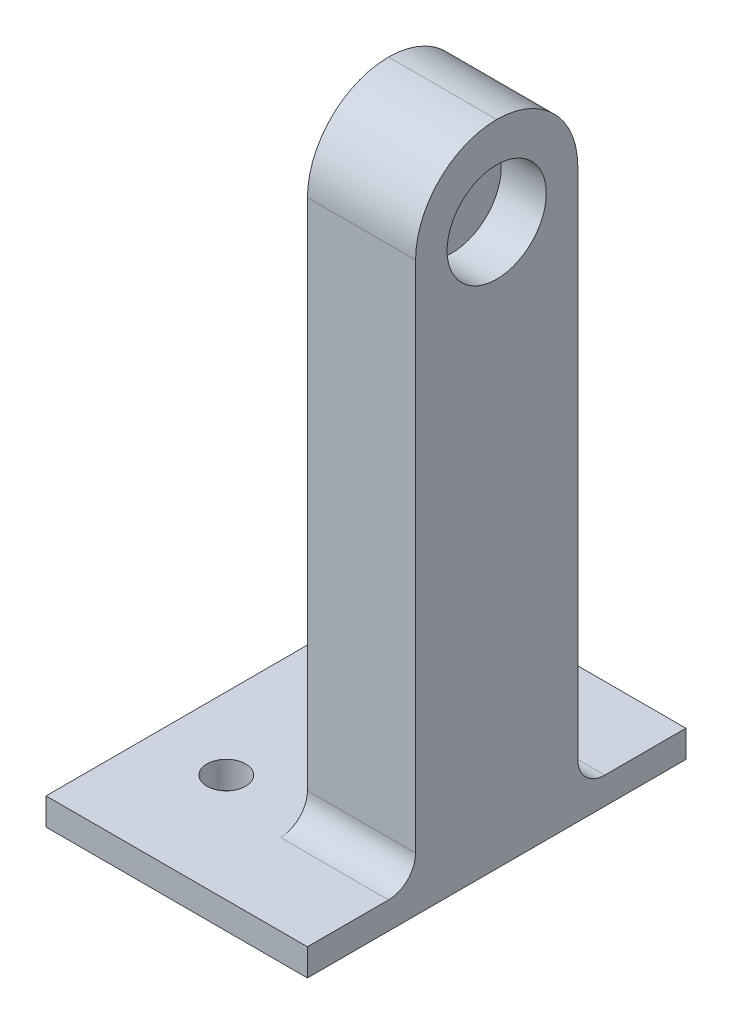
ISO-10303-21;
HEADER;
FILE_DESCRIPTION(('STEP AP214'),'2;1');
FILE_NAME('part.step','',(''),(''),'','','');
FILE_SCHEMA(('AUTOMOTIVE_DESIGN { 1 0 10303 214 1 1 1 1 }'));
ENDSEC;
DATA;
#1=APPLICATION_CONTEXT('core data for automotive mechanical design processes');
#2=APPLICATION_PROTOCOL_DEFINITION('international standard','automotive_design',2000,#1);
#3=PRODUCT_CONTEXT('',#1,'mechanical');
#4=PRODUCT('Part','Part','',(#3));
#5=PRODUCT_RELATED_PRODUCT_CATEGORY('part','',(#4));
#6=PRODUCT_DEFINITION_FORMATION('','',#4);
#7=PRODUCT_DEFINITION_CONTEXT('part definition',#1,'design');
#8=PRODUCT_DEFINITION('design','',#6,#7);
#9=PRODUCT_DEFINITION_SHAPE('','',#8);
#10=(LENGTH_UNIT() NAMED_UNIT(*) SI_UNIT(.MILLI.,.METRE.));
#11=(NAMED_UNIT(*) PLANE_ANGLE_UNIT() SI_UNIT($,.RADIAN.));
#12=(NAMED_UNIT(*) SI_UNIT($,.STERADIAN.) SOLID_ANGLE_UNIT());
#13=UNCERTAINTY_MEASURE_WITH_UNIT(LENGTH_MEASURE(1.E-05),#10,'distance_accuracy_value','');
#14=(GEOMETRIC_REPRESENTATION_CONTEXT(3) GLOBAL_UNCERTAINTY_ASSIGNED_CONTEXT((#13)) GLOBAL_UNIT_ASSIGNED_CONTEXT((#10,
#11,#12)) REPRESENTATION_CONTEXT('',''));
#15=CARTESIAN_POINT('',(0.,0.,0.));
#16=DIRECTION('',(0.,0.,1.));
#17=DIRECTION('',(1.,0.,0.));
#18=AXIS2_PLACEMENT_3D('',#15,#16,#17);
#19=CARTESIAN_POINT('',(0.,3.,0.));
#20=DIRECTION('',(0.,1.,0.));
#21=DIRECTION('',(0.,0.,1.));
#22=AXIS2_PLACEMENT_3D('',#19,#20,#21);
#23=PLANE('',#22);
#24=DIRECTION('',(0.,0.,-1.));
#25=VECTOR('',#24,1.);
#26=CARTESIAN_POINT('',(24.,3.,0.));
#27=LINE('',#26,#25);
#28=CARTESIAN_POINT('',(24.,3.,42.));
#29=VERTEX_POINT('',#28);
#30=CARTESIAN_POINT('',(24.,3.,0.));
#31=VERTEX_POINT('',#30);
#32=EDGE_CURVE('E129',#29,#31,#27,.T.);
#33=ORIENTED_EDGE('',*,*,#32,.F.);
#34=DIRECTION('',(1.,0.,0.));
#35=VECTOR('',#34,1.);
#36=CARTESIAN_POINT('',(0.,3.,42.));
#37=LINE('',#36,#35);
#38=CARTESIAN_POINT('',(53.,3.,42.));
#39=VERTEX_POINT('',#38);
#40=EDGE_CURVE('E136',#29,#39,#37,.T.);
#41=ORIENTED_EDGE('',*,*,#40,.T.);
#42=DIRECTION('',(0.,0.,1.));
#43=VECTOR('',#42,1.);
#44=CARTESIAN_POINT('',(53.,3.,0.));
#45=LINE('',#44,#43);
#46=CARTESIAN_POINT('',(53.,3.00000000000001,33.));
#47=VERTEX_POINT('',#46);
#48=EDGE_CURVE('E235',#47,#39,#45,.T.);
#49=ORIENTED_EDGE('',*,*,#48,.F.);
#50=DIRECTION('',(1.,0.,0.));
#51=VECTOR('',#50,1.);
#52=CARTESIAN_POINT('',(0.,3.,33.));
#53=LINE('',#52,#51);
#54=CARTESIAN_POINT('',(41.,3.,33.));
#55=VERTEX_POINT('',#54);
#56=EDGE_CURVE('E189',#47,#55,#53,.F.);
#57=ORIENTED_EDGE('',*,*,#56,.T.);
#58=DIRECTION('',(0.,0.,1.));
#59=VECTOR('',#58,1.);
#60=CARTESIAN_POINT('',(41.,3.,12.));
#61=LINE('',#60,#59);
#62=CARTESIAN_POINT('',(41.,3.,9.00000000000001));
#63=VERTEX_POINT('',#62);
#64=EDGE_CURVE('E219',#63,#55,#61,.T.);
#65=ORIENTED_EDGE('',*,*,#64,.F.);
#66=DIRECTION('',(-1.,0.,0.));
#67=VECTOR('',#66,1.);
#68=CARTESIAN_POINT('',(0.,3.,9.00000000000001));
#69=LINE('',#68,#67);
#70=CARTESIAN_POINT('',(53.,3.00000000000001,9.00000000000001));
#71=VERTEX_POINT('',#70);
#72=EDGE_CURVE('E193',#63,#71,#69,.F.);
#73=ORIENTED_EDGE('',*,*,#72,.T.);
#74=CARTESIAN_POINT('',(53.,3.,0.));
#75=VERTEX_POINT('',#74);
#76=EDGE_CURVE('E185',#75,#71,#45,.T.);
#77=ORIENTED_EDGE('',*,*,#76,.F.);
#78=DIRECTION('',(-1.,0.,0.));
#79=VECTOR('',#78,1.);
#80=CARTESIAN_POINT('',(0.,3.,0.));
#81=LINE('',#80,#79);
#82=EDGE_CURVE('E140',#75,#31,#81,.T.);
#83=ORIENTED_EDGE('',*,*,#82,.T.);
#84=EDGE_LOOP('',(#33,#41,#49,#57,#65,#73,#77,#83));
#85=FACE_BOUND('',#84,.T.);
#86=CARTESIAN_POINT('',(32.,3.,12.));
#87=DIRECTION('',(0.,1.,0.));
#88=DIRECTION('',(0.,0.,1.));
#89=AXIS2_PLACEMENT_3D('',#86,#87,#88);
#90=CIRCLE('',#89,2.15);
#91=CARTESIAN_POINT('',(32.,3.,14.15));
#92=VERTEX_POINT('',#91);
#93=EDGE_CURVE('E159',#92,#92,#90,.T.);
#94=ORIENTED_EDGE('',*,*,#93,.F.);
#95=EDGE_LOOP('',(#94));
#96=FACE_BOUND('',#95,.T.);
#97=CARTESIAN_POINT('',(32.,3.,30.));
#98=DIRECTION('',(0.,1.,0.));
#99=DIRECTION('',(0.,0.,1.));
#100=AXIS2_PLACEMENT_3D('',#97,#98,#99);
#101=CIRCLE('',#100,2.15);
#102=CARTESIAN_POINT('',(32.,3.,32.15));
#103=VERTEX_POINT('',#102);
#104=EDGE_CURVE('E246',#103,#103,#101,.T.);
#105=ORIENTED_EDGE('',*,*,#104,.F.);
#106=EDGE_LOOP('',(#105));
#107=FACE_BOUND('',#106,.T.);
#108=ADVANCED_FACE('F44',(#85,#96,#107),#23,.T.);
#109=CARTESIAN_POINT('',(0.,3.,42.));
#110=DIRECTION('',(0.,0.,-1.));
#111=DIRECTION('',(-1.,0.,0.));
#112=AXIS2_PLACEMENT_3D('',#109,#110,#111);
#113=PLANE('',#112);
#114=ORIENTED_EDGE('',*,*,#40,.F.);
#115=DIRECTION('',(0.,1.,0.));
#116=VECTOR('',#115,1.);
#117=CARTESIAN_POINT('',(24.,-7.,42.));
#118=LINE('',#117,#116);
#119=CARTESIAN_POINT('',(24.,0.,42.));
#120=VERTEX_POINT('',#119);
#121=EDGE_CURVE('E126',#120,#29,#118,.T.);
#122=ORIENTED_EDGE('',*,*,#121,.F.);
#123=DIRECTION('',(1.,0.,0.));
#124=VECTOR('',#123,1.);
#125=CARTESIAN_POINT('',(0.,0.,42.));
#126=LINE('',#125,#124);
#127=CARTESIAN_POINT('',(53.,0.,42.));
#128=VERTEX_POINT('',#127);
#129=EDGE_CURVE('E67',#120,#128,#126,.T.);
#130=ORIENTED_EDGE('',*,*,#129,.T.);
#131=DIRECTION('',(0.,1.,0.));
#132=VECTOR('',#131,1.);
#133=CARTESIAN_POINT('',(53.,3.,42.));
#134=LINE('',#133,#132);
#135=EDGE_CURVE('E144',#128,#39,#134,.T.);
#136=ORIENTED_EDGE('',*,*,#135,.T.);
#137=EDGE_LOOP('',(#114,#122,#130,#136));
#138=FACE_BOUND('',#137,.T.);
#139=ADVANCED_FACE('F143',(#138),#113,.F.);
#140=CARTESIAN_POINT('',(0.,3.,0.));
#141=DIRECTION('',(0.,0.,1.));
#142=DIRECTION('',(1.,0.,0.));
#143=AXIS2_PLACEMENT_3D('',#140,#141,#142);
#144=PLANE('',#143);
#145=DIRECTION('',(-1.,0.,0.));
#146=VECTOR('',#145,1.);
#147=CARTESIAN_POINT('',(0.,0.,0.));
#148=LINE('',#147,#146);
#149=CARTESIAN_POINT('',(53.,0.,0.));
#150=VERTEX_POINT('',#149);
#151=CARTESIAN_POINT('',(24.,0.,0.));
#152=VERTEX_POINT('',#151);
#153=EDGE_CURVE('E146',#150,#152,#148,.T.);
#154=ORIENTED_EDGE('',*,*,#153,.T.);
#155=DIRECTION('',(0.,1.,0.));
#156=VECTOR('',#155,1.);
#157=CARTESIAN_POINT('',(24.,-7.,0.));
#158=LINE('',#157,#156);
#159=EDGE_CURVE('E60',#152,#31,#158,.T.);
#160=ORIENTED_EDGE('',*,*,#159,.T.);
#161=ORIENTED_EDGE('',*,*,#82,.F.);
#162=DIRECTION('',(0.,-1.,0.));
#163=VECTOR('',#162,1.);
#164=CARTESIAN_POINT('',(53.,72.,0.));
#165=LINE('',#164,#163);
#166=EDGE_CURVE('E340',#75,#150,#165,.T.);
#167=ORIENTED_EDGE('',*,*,#166,.T.);
#168=EDGE_LOOP('',(#154,#160,#161,#167));
#169=FACE_BOUND('',#168,.T.);
#170=ADVANCED_FACE('F282',(#169),#144,.F.);
#171=CARTESIAN_POINT('',(0.,0.,0.));
#172=DIRECTION('',(0.,1.,0.));
#173=DIRECTION('',(0.,0.,1.));
#174=AXIS2_PLACEMENT_3D('',#171,#172,#173);
#175=PLANE('',#174);
#176=CARTESIAN_POINT('',(32.,0.,12.));
#177=DIRECTION('',(0.,1.,0.));
#178=DIRECTION('',(0.,0.,1.));
#179=AXIS2_PLACEMENT_3D('',#176,#177,#178);
#180=CIRCLE('',#179,2.15);
#181=CARTESIAN_POINT('',(32.,0.,14.15));
#182=VERTEX_POINT('',#181);
#183=EDGE_CURVE('E155',#182,#182,#180,.T.);
#184=ORIENTED_EDGE('',*,*,#183,.T.);
#185=EDGE_LOOP('',(#184));
#186=FACE_BOUND('',#185,.T.);
#187=CARTESIAN_POINT('',(32.,0.,30.));
#188=DIRECTION('',(0.,1.,0.));
#189=DIRECTION('',(0.,0.,1.));
#190=AXIS2_PLACEMENT_3D('',#187,#188,#189);
#191=CIRCLE('',#190,2.15);
#192=CARTESIAN_POINT('',(32.,0.,32.15));
#193=VERTEX_POINT('',#192);
#194=EDGE_CURVE('E229',#193,#193,#191,.T.);
#195=ORIENTED_EDGE('',*,*,#194,.T.);
#196=EDGE_LOOP('',(#195));
#197=FACE_BOUND('',#196,.T.);
#198=ORIENTED_EDGE('',*,*,#129,.F.);
#199=DIRECTION('',(0.,0.,-1.));
#200=VECTOR('',#199,1.);
#201=CARTESIAN_POINT('',(24.,0.,0.));
#202=LINE('',#201,#200);
#203=EDGE_CURVE('E11',#120,#152,#202,.T.);
#204=ORIENTED_EDGE('',*,*,#203,.T.);
#205=ORIENTED_EDGE('',*,*,#153,.F.);
#206=DIRECTION('',(0.,0.,-1.));
#207=VECTOR('',#206,1.);
#208=CARTESIAN_POINT('',(53.,0.,100.));
#209=LINE('',#208,#207);
#210=EDGE_CURVE('E337',#128,#150,#209,.T.);
#211=ORIENTED_EDGE('',*,*,#210,.F.);
#212=EDGE_LOOP('',(#198,#204,#205,#211));
#213=FACE_BOUND('',#212,.T.);
#214=ADVANCED_FACE('F260',(#186,#197,#213),#175,.F.);
#215=CARTESIAN_POINT('',(32.,0.,30.));
#216=DIRECTION('',(0.,1.,0.));
#217=DIRECTION('',(0.,0.,1.));
#218=AXIS2_PLACEMENT_3D('',#215,#216,#217);
#219=CYLINDRICAL_SURFACE('',#218,2.15);
#220=ORIENTED_EDGE('',*,*,#194,.F.);
#221=EDGE_LOOP('',(#220));
#222=FACE_BOUND('',#221,.T.);
#223=ORIENTED_EDGE('',*,*,#104,.T.);
#224=EDGE_LOOP('',(#223));
#225=FACE_BOUND('',#224,.T.);
#226=ADVANCED_FACE('F265',(#222,#225),#219,.F.);
#227=CARTESIAN_POINT('',(32.,0.,12.));
#228=DIRECTION('',(0.,1.,0.));
#229=DIRECTION('',(0.,0.,1.));
#230=AXIS2_PLACEMENT_3D('',#227,#228,#229);
#231=CYLINDRICAL_SURFACE('',#230,2.15);
#232=ORIENTED_EDGE('',*,*,#183,.F.);
#233=EDGE_LOOP('',(#232));
#234=FACE_BOUND('',#233,.T.);
#235=ORIENTED_EDGE('',*,*,#93,.T.);
#236=EDGE_LOOP('',(#235));
#237=FACE_BOUND('',#236,.T.);
#238=ADVANCED_FACE('F263',(#234,#237),#231,.F.);
#239=CARTESIAN_POINT('',(41.,72.,12.));
#240=DIRECTION('',(1.,0.,0.));
#241=DIRECTION('',(0.,0.,-1.));
#242=AXIS2_PLACEMENT_3D('',#239,#240,#241);
#243=PLANE('',#242);
#244=CARTESIAN_POINT('',(41.,62.15,21.));
#245=DIRECTION('',(-1.,0.,0.));
#246=DIRECTION('',(0.,0.,1.));
#247=AXIS2_PLACEMENT_3D('',#244,#245,#246);
#248=CIRCLE('',#247,5.5);
#249=CARTESIAN_POINT('',(41.,62.15,26.5));
#250=VERTEX_POINT('',#249);
#251=EDGE_CURVE('E184',#250,#250,#248,.T.);
#252=ORIENTED_EDGE('',*,*,#251,.F.);
#253=EDGE_LOOP('',(#252));
#254=FACE_BOUND('',#253,.T.);
#255=CARTESIAN_POINT('',(41.,63.,21.));
#256=DIRECTION('',(1.,0.,0.));
#257=DIRECTION('',(0.,0.,-1.));
#258=AXIS2_PLACEMENT_3D('',#255,#256,#257);
#259=CIRCLE('',#258,9.);
#260=CARTESIAN_POINT('',(41.,63.,30.));
#261=VERTEX_POINT('',#260);
#262=CARTESIAN_POINT('',(41.,72.,21.));
#263=VERTEX_POINT('',#262);
#264=EDGE_CURVE('E150',#261,#263,#259,.F.);
#265=ORIENTED_EDGE('',*,*,#264,.T.);
#266=CARTESIAN_POINT('',(41.,63.,21.));
#267=DIRECTION('',(1.,0.,0.));
#268=DIRECTION('',(0.,0.,-1.));
#269=AXIS2_PLACEMENT_3D('',#266,#267,#268);
#270=CIRCLE('',#269,9.);
#271=CARTESIAN_POINT('',(41.,63.,12.));
#272=VERTEX_POINT('',#271);
#273=EDGE_CURVE('E163',#263,#272,#270,.F.);
#274=ORIENTED_EDGE('',*,*,#273,.T.);
#275=DIRECTION('',(0.,-1.,0.));
#276=VECTOR('',#275,1.);
#277=CARTESIAN_POINT('',(41.,72.,12.));
#278=LINE('',#277,#276);
#279=CARTESIAN_POINT('',(41.,6.00000000000001,12.));
#280=VERTEX_POINT('',#279);
#281=EDGE_CURVE('E242',#272,#280,#278,.T.);
#282=ORIENTED_EDGE('',*,*,#281,.T.);
#283=CARTESIAN_POINT('',(41.,6.00000000000001,9.00000000000001));
#284=DIRECTION('',(1.,0.,0.));
#285=DIRECTION('',(0.,0.,-1.));
#286=AXIS2_PLACEMENT_3D('',#283,#284,#285);
#287=CIRCLE('',#286,3.);
#288=EDGE_CURVE('E201',#280,#63,#287,.T.);
#289=ORIENTED_EDGE('',*,*,#288,.T.);
#290=ORIENTED_EDGE('',*,*,#64,.T.);
#291=CARTESIAN_POINT('',(41.,6.00000000000001,33.));
#292=DIRECTION('',(1.,0.,0.));
#293=DIRECTION('',(0.,0.,-1.));
#294=AXIS2_PLACEMENT_3D('',#291,#292,#293);
#295=CIRCLE('',#294,3.);
#296=CARTESIAN_POINT('',(41.,6.00000000000001,30.));
#297=VERTEX_POINT('',#296);
#298=EDGE_CURVE('E53',#55,#297,#295,.T.);
#299=ORIENTED_EDGE('',*,*,#298,.T.);
#300=DIRECTION('',(0.,-1.,0.));
#301=VECTOR('',#300,1.);
#302=CARTESIAN_POINT('',(41.,72.,30.));
#303=LINE('',#302,#301);
#304=EDGE_CURVE('E217',#261,#297,#303,.T.);
#305=ORIENTED_EDGE('',*,*,#304,.F.);
#306=EDGE_LOOP('',(#265,#274,#282,#289,#290,#299,#305));
#307=FACE_BOUND('',#306,.T.);
#308=ADVANCED_FACE('F216',(#254,#307),#243,.F.);
#309=CARTESIAN_POINT('',(41.,72.,30.));
#310=DIRECTION('',(0.,0.,-1.));
#311=DIRECTION('',(-1.,0.,0.));
#312=AXIS2_PLACEMENT_3D('',#309,#310,#311);
#313=PLANE('',#312);
#314=ORIENTED_EDGE('',*,*,#304,.T.);
#315=DIRECTION('',(1.,0.,0.));
#316=VECTOR('',#315,1.);
#317=CARTESIAN_POINT('',(41.,6.00000000000001,30.));
#318=LINE('',#317,#316);
#319=CARTESIAN_POINT('',(53.,6.00000000000001,30.));
#320=VERTEX_POINT('',#319);
#321=EDGE_CURVE('E197',#297,#320,#318,.T.);
#322=ORIENTED_EDGE('',*,*,#321,.T.);
#323=DIRECTION('',(0.,-1.,0.));
#324=VECTOR('',#323,1.);
#325=CARTESIAN_POINT('',(53.,72.,30.));
#326=LINE('',#325,#324);
#327=CARTESIAN_POINT('',(53.,63.,30.));
#328=VERTEX_POINT('',#327);
#329=EDGE_CURVE('E230',#328,#320,#326,.T.);
#330=ORIENTED_EDGE('',*,*,#329,.F.);
#331=DIRECTION('',(1.,0.,0.));
#332=VECTOR('',#331,1.);
#333=CARTESIAN_POINT('',(41.,63.,30.));
#334=LINE('',#333,#332);
#335=EDGE_CURVE('E176',#328,#261,#334,.F.);
#336=ORIENTED_EDGE('',*,*,#335,.T.);
#337=EDGE_LOOP('',(#314,#322,#330,#336));
#338=FACE_BOUND('',#337,.T.);
#339=ADVANCED_FACE('F224',(#338),#313,.F.);
#340=CARTESIAN_POINT('',(53.,72.,12.));
#341=DIRECTION('',(-1.,0.,0.));
#342=DIRECTION('',(0.,0.,1.));
#343=AXIS2_PLACEMENT_3D('',#340,#341,#342);
#344=PLANE('',#343);
#345=CARTESIAN_POINT('',(53.,62.15,21.));
#346=DIRECTION('',(1.,0.,0.));
#347=DIRECTION('',(0.,0.,-1.));
#348=AXIS2_PLACEMENT_3D('',#345,#346,#347);
#349=CIRCLE('',#348,5.5);
#350=CARTESIAN_POINT('',(53.,62.15,15.5));
#351=VERTEX_POINT('',#350);
#352=EDGE_CURVE('E319',#351,#351,#349,.T.);
#353=ORIENTED_EDGE('',*,*,#352,.F.);
#354=EDGE_LOOP('',(#353));
#355=FACE_BOUND('',#354,.T.);
#356=DIRECTION('',(0.,-1.,0.));
#357=VECTOR('',#356,1.);
#358=CARTESIAN_POINT('',(53.,72.,12.));
#359=LINE('',#358,#357);
#360=CARTESIAN_POINT('',(53.,63.,12.));
#361=VERTEX_POINT('',#360);
#362=CARTESIAN_POINT('',(53.,6.00000000000001,12.));
#363=VERTEX_POINT('',#362);
#364=EDGE_CURVE('E238',#361,#363,#359,.T.);
#365=ORIENTED_EDGE('',*,*,#364,.F.);
#366=CARTESIAN_POINT('',(53.,63.,21.));
#367=DIRECTION('',(-1.,0.,0.));
#368=DIRECTION('',(0.,0.,1.));
#369=AXIS2_PLACEMENT_3D('',#366,#367,#368);
#370=CIRCLE('',#369,9.);
#371=CARTESIAN_POINT('',(53.,72.,21.));
#372=VERTEX_POINT('',#371);
#373=EDGE_CURVE('E173',#361,#372,#370,.F.);
#374=ORIENTED_EDGE('',*,*,#373,.T.);
#375=CARTESIAN_POINT('',(53.,63.,21.));
#376=DIRECTION('',(-1.,0.,0.));
#377=DIRECTION('',(0.,0.,1.));
#378=AXIS2_PLACEMENT_3D('',#375,#376,#377);
#379=CIRCLE('',#378,9.);
#380=EDGE_CURVE('E170',#372,#328,#379,.F.);
#381=ORIENTED_EDGE('',*,*,#380,.T.);
#382=ORIENTED_EDGE('',*,*,#329,.T.);
#383=CARTESIAN_POINT('',(53.,6.00000000000001,33.));
#384=DIRECTION('',(-1.,0.,0.));
#385=DIRECTION('',(0.,0.,1.));
#386=AXIS2_PLACEMENT_3D('',#383,#384,#385);
#387=CIRCLE('',#386,3.);
#388=EDGE_CURVE('E208',#320,#47,#387,.T.);
#389=ORIENTED_EDGE('',*,*,#388,.T.);
#390=ORIENTED_EDGE('',*,*,#48,.T.);
#391=ORIENTED_EDGE('',*,*,#135,.F.);
#392=ORIENTED_EDGE('',*,*,#210,.T.);
#393=ORIENTED_EDGE('',*,*,#166,.F.);
#394=ORIENTED_EDGE('',*,*,#76,.T.);
#395=CARTESIAN_POINT('',(53.,6.00000000000001,9.00000000000001));
#396=DIRECTION('',(-1.,0.,0.));
#397=DIRECTION('',(0.,0.,1.));
#398=AXIS2_PLACEMENT_3D('',#395,#396,#397);
#399=CIRCLE('',#398,3.);
#400=EDGE_CURVE('E205',#71,#363,#399,.T.);
#401=ORIENTED_EDGE('',*,*,#400,.T.);
#402=EDGE_LOOP('',(#365,#374,#381,#382,#389,#390,#391,#392,#393,#394,#401));
#403=FACE_BOUND('',#402,.T.);
#404=ADVANCED_FACE('F234',(#355,#403),#344,.F.);
#405=CARTESIAN_POINT('',(41.,72.,12.));
#406=DIRECTION('',(0.,0.,1.));
#407=DIRECTION('',(1.,0.,0.));
#408=AXIS2_PLACEMENT_3D('',#405,#406,#407);
#409=PLANE('',#408);
#410=ORIENTED_EDGE('',*,*,#364,.T.);
#411=DIRECTION('',(-1.,0.,0.));
#412=VECTOR('',#411,1.);
#413=CARTESIAN_POINT('',(41.,6.00000000000001,12.));
#414=LINE('',#413,#412);
#415=EDGE_CURVE('E179',#363,#280,#414,.T.);
#416=ORIENTED_EDGE('',*,*,#415,.T.);
#417=ORIENTED_EDGE('',*,*,#281,.F.);
#418=DIRECTION('',(-1.,0.,0.));
#419=VECTOR('',#418,1.);
#420=CARTESIAN_POINT('',(53.,63.,12.));
#421=LINE('',#420,#419);
#422=EDGE_CURVE('E166',#272,#361,#421,.F.);
#423=ORIENTED_EDGE('',*,*,#422,.T.);
#424=EDGE_LOOP('',(#410,#416,#417,#423));
#425=FACE_BOUND('',#424,.T.);
#426=ADVANCED_FACE('F308',(#425),#409,.F.);
#427=CARTESIAN_POINT('',(48.,62.15,21.));
#428=DIRECTION('',(1.,0.,0.));
#429=DIRECTION('',(0.,0.,-1.));
#430=AXIS2_PLACEMENT_3D('',#427,#428,#429);
#431=CYLINDRICAL_SURFACE('',#430,5.5);
#432=CARTESIAN_POINT('',(48.,62.15,21.));
#433=DIRECTION('',(1.,0.,0.));
#434=DIRECTION('',(0.,0.,-1.));
#435=AXIS2_PLACEMENT_3D('',#432,#433,#434);
#436=CIRCLE('',#435,5.5);
#437=CARTESIAN_POINT('',(48.,62.15,15.5));
#438=VERTEX_POINT('',#437);
#439=EDGE_CURVE('E316',#438,#438,#436,.T.);
#440=ORIENTED_EDGE('',*,*,#439,.F.);
#441=EDGE_LOOP('',(#440));
#442=FACE_BOUND('',#441,.T.);
#443=ORIENTED_EDGE('',*,*,#352,.T.);
#444=EDGE_LOOP('',(#443));
#445=FACE_BOUND('',#444,.T.);
#446=ADVANCED_FACE('F363',(#442,#445),#431,.F.);
#447=CARTESIAN_POINT('',(48.,62.15,21.));
#448=DIRECTION('',(1.,0.,0.));
#449=DIRECTION('',(0.,0.,-1.));
#450=AXIS2_PLACEMENT_3D('',#447,#448,#449);
#451=PLANE('',#450);
#452=ORIENTED_EDGE('',*,*,#439,.T.);
#453=EDGE_LOOP('',(#452));
#454=FACE_BOUND('',#453,.T.);
#455=ADVANCED_FACE('F355',(#454),#451,.T.);
#456=CARTESIAN_POINT('',(46.,62.15,21.));
#457=DIRECTION('',(-1.,0.,0.));
#458=DIRECTION('',(0.,0.,1.));
#459=AXIS2_PLACEMENT_3D('',#456,#457,#458);
#460=CYLINDRICAL_SURFACE('',#459,5.5);
#461=CARTESIAN_POINT('',(46.,62.15,21.));
#462=DIRECTION('',(-1.,0.,0.));
#463=DIRECTION('',(0.,0.,1.));
#464=AXIS2_PLACEMENT_3D('',#461,#462,#463);
#465=CIRCLE('',#464,5.5);
#466=CARTESIAN_POINT('',(46.,62.15,26.5));
#467=VERTEX_POINT('',#466);
#468=EDGE_CURVE('E323',#467,#467,#465,.T.);
#469=ORIENTED_EDGE('',*,*,#468,.F.);
#470=EDGE_LOOP('',(#469));
#471=FACE_BOUND('',#470,.T.);
#472=ORIENTED_EDGE('',*,*,#251,.T.);
#473=EDGE_LOOP('',(#472));
#474=FACE_BOUND('',#473,.T.);
#475=ADVANCED_FACE('F352',(#471,#474),#460,.F.);
#476=CARTESIAN_POINT('',(46.,62.15,21.));
#477=DIRECTION('',(-1.,0.,0.));
#478=DIRECTION('',(0.,0.,1.));
#479=AXIS2_PLACEMENT_3D('',#476,#477,#478);
#480=PLANE('',#479);
#481=ORIENTED_EDGE('',*,*,#468,.T.);
#482=EDGE_LOOP('',(#481));
#483=FACE_BOUND('',#482,.T.);
#484=ADVANCED_FACE('F297',(#483),#480,.T.);
#485=CARTESIAN_POINT('',(0.,63.,21.));
#486=DIRECTION('',(-1.,0.,0.));
#487=DIRECTION('',(0.,0.,1.));
#488=AXIS2_PLACEMENT_3D('',#485,#486,#487);
#489=CYLINDRICAL_SURFACE('',#488,9.);
#490=ORIENTED_EDGE('',*,*,#335,.F.);
#491=ORIENTED_EDGE('',*,*,#380,.F.);
#492=DIRECTION('',(1.,0.,0.));
#493=VECTOR('',#492,1.);
#494=CARTESIAN_POINT('',(53.,72.,21.));
#495=LINE('',#494,#493);
#496=EDGE_CURVE('E180',#263,#372,#495,.T.);
#497=ORIENTED_EDGE('',*,*,#496,.F.);
#498=ORIENTED_EDGE('',*,*,#264,.F.);
#499=EDGE_LOOP('',(#490,#491,#497,#498));
#500=FACE_BOUND('',#499,.T.);
#501=ADVANCED_FACE('F294',(#500),#489,.T.);
#502=CARTESIAN_POINT('',(0.,63.,21.));
#503=DIRECTION('',(1.,0.,0.));
#504=DIRECTION('',(0.,0.,-1.));
#505=AXIS2_PLACEMENT_3D('',#502,#503,#504);
#506=CYLINDRICAL_SURFACE('',#505,9.);
#507=ORIENTED_EDGE('',*,*,#373,.F.);
#508=ORIENTED_EDGE('',*,*,#422,.F.);
#509=ORIENTED_EDGE('',*,*,#273,.F.);
#510=ORIENTED_EDGE('',*,*,#496,.T.);
#511=EDGE_LOOP('',(#507,#508,#509,#510));
#512=FACE_BOUND('',#511,.T.);
#513=ADVANCED_FACE('F290',(#512),#506,.T.);
#514=CARTESIAN_POINT('',(41.,6.00000000000001,9.00000000000001));
#515=DIRECTION('',(-1.,0.,0.));
#516=DIRECTION('',(0.,0.,1.));
#517=AXIS2_PLACEMENT_3D('',#514,#515,#516);
#518=CYLINDRICAL_SURFACE('',#517,3.);
#519=ORIENTED_EDGE('',*,*,#400,.F.);
#520=ORIENTED_EDGE('',*,*,#72,.F.);
#521=ORIENTED_EDGE('',*,*,#288,.F.);
#522=ORIENTED_EDGE('',*,*,#415,.F.);
#523=EDGE_LOOP('',(#519,#520,#521,#522));
#524=FACE_BOUND('',#523,.T.);
#525=ADVANCED_FACE('F293',(#524),#518,.F.);
#526=CARTESIAN_POINT('',(41.,6.00000000000001,33.));
#527=DIRECTION('',(1.,0.,0.));
#528=DIRECTION('',(0.,0.,-1.));
#529=AXIS2_PLACEMENT_3D('',#526,#527,#528);
#530=CYLINDRICAL_SURFACE('',#529,3.);
#531=ORIENTED_EDGE('',*,*,#298,.F.);
#532=ORIENTED_EDGE('',*,*,#56,.F.);
#533=ORIENTED_EDGE('',*,*,#388,.F.);
#534=ORIENTED_EDGE('',*,*,#321,.F.);
#535=EDGE_LOOP('',(#531,#532,#533,#534));
#536=FACE_BOUND('',#535,.T.);
#537=ADVANCED_FACE('F46',(#536),#530,.F.);
#538=CARTESIAN_POINT('',(24.,-7.,0.));
#539=DIRECTION('',(1.,0.,0.));
#540=DIRECTION('',(0.,0.,-1.));
#541=AXIS2_PLACEMENT_3D('',#538,#539,#540);
#542=PLANE('',#541);
#543=ORIENTED_EDGE('',*,*,#121,.T.);
#544=ORIENTED_EDGE('',*,*,#32,.T.);
#545=ORIENTED_EDGE('',*,*,#159,.F.);
#546=ORIENTED_EDGE('',*,*,#203,.F.);
#547=EDGE_LOOP('',(#543,#544,#545,#546));
#548=FACE_BOUND('',#547,.T.);
#549=ADVANCED_FACE('F128',(#548),#542,.F.);
#550=CLOSED_SHELL('',(#108,#139,#170,#214,#226,#238,#308,#339,#404,#426,#446,#455,#475,#484,
#501,#513,#525,#537,#549));
#551=MANIFOLD_SOLID_BREP('B2',#550);
#552=ADVANCED_BREP_SHAPE_REPRESENTATION('',(#18,#551),#14);
#553=SHAPE_DEFINITION_REPRESENTATION(#9,#552);
ENDSEC;
END-ISO-10303-21;
